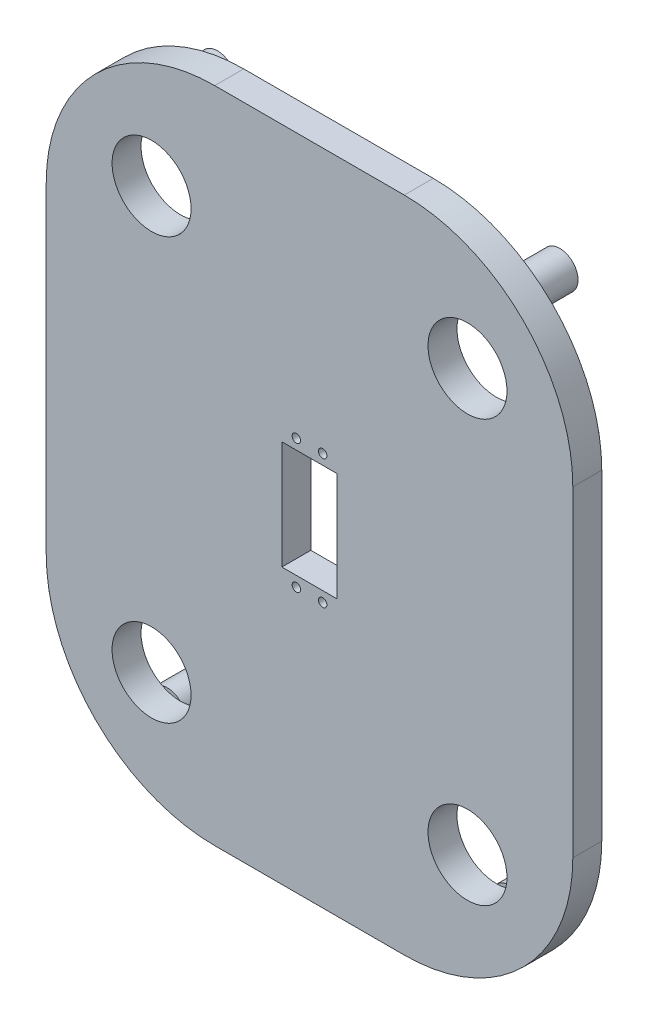
ISO-10303-21;
HEADER;
FILE_DESCRIPTION(('STEP AP214'),'2;1');
FILE_NAME('part.step','',(''),(''),'','','');
FILE_SCHEMA(('AUTOMOTIVE_DESIGN { 1 0 10303 214 1 1 1 1 }'));
ENDSEC;
DATA;
#1=APPLICATION_CONTEXT('core data for automotive mechanical design processes');
#2=APPLICATION_PROTOCOL_DEFINITION('international standard','automotive_design',2000,#1);
#3=PRODUCT_CONTEXT('',#1,'mechanical');
#4=PRODUCT('Part','Part','',(#3));
#5=PRODUCT_RELATED_PRODUCT_CATEGORY('part','',(#4));
#6=PRODUCT_DEFINITION_FORMATION('','',#4);
#7=PRODUCT_DEFINITION_CONTEXT('part definition',#1,'design');
#8=PRODUCT_DEFINITION('design','',#6,#7);
#9=PRODUCT_DEFINITION_SHAPE('','',#8);
#10=(LENGTH_UNIT() NAMED_UNIT(*) SI_UNIT(.MILLI.,.METRE.));
#11=(NAMED_UNIT(*) PLANE_ANGLE_UNIT() SI_UNIT($,.RADIAN.));
#12=(NAMED_UNIT(*) SI_UNIT($,.STERADIAN.) SOLID_ANGLE_UNIT());
#13=UNCERTAINTY_MEASURE_WITH_UNIT(LENGTH_MEASURE(1.E-05),#10,'distance_accuracy_value','');
#14=(GEOMETRIC_REPRESENTATION_CONTEXT(3) GLOBAL_UNCERTAINTY_ASSIGNED_CONTEXT((#13)) GLOBAL_UNIT_ASSIGNED_CONTEXT((#10,
#11,#12)) REPRESENTATION_CONTEXT('',''));
#15=CARTESIAN_POINT('',(0.,0.,0.));
#16=DIRECTION('',(0.,0.,1.));
#17=DIRECTION('',(1.,0.,0.));
#18=AXIS2_PLACEMENT_3D('',#15,#16,#17);
#19=CARTESIAN_POINT('',(-2.50000000000001,-50.,11.));
#20=DIRECTION('',(0.,0.,1.));
#21=DIRECTION('',(1.,0.,0.));
#22=AXIS2_PLACEMENT_3D('',#19,#20,#21);
#23=PLANE('',#22);
#24=CARTESIAN_POINT('',(-62.5,-25.,11.));
#25=DIRECTION('',(0.,0.,1.));
#26=DIRECTION('',(1.,0.,0.));
#27=AXIS2_PLACEMENT_3D('',#24,#25,#26);
#28=CIRCLE('',#27,15.);
#29=CARTESIAN_POINT('',(-47.5,-25.,11.));
#30=VERTEX_POINT('',#29);
#31=EDGE_CURVE('E284',#30,#30,#28,.F.);
#32=ORIENTED_EDGE('',*,*,#31,.T.);
#33=EDGE_LOOP('',(#32));
#34=FACE_BOUND('',#33,.T.);
#35=CARTESIAN_POINT('',(57.5,-24.9999999999999,11.));
#36=DIRECTION('',(0.,0.,1.));
#37=DIRECTION('',(1.,0.,0.));
#38=AXIS2_PLACEMENT_3D('',#35,#36,#37);
#39=CIRCLE('',#38,15.);
#40=CARTESIAN_POINT('',(72.5,-24.9999999999999,11.));
#41=VERTEX_POINT('',#40);
#42=EDGE_CURVE('E498',#41,#41,#39,.T.);
#43=ORIENTED_EDGE('',*,*,#42,.F.);
#44=EDGE_LOOP('',(#43));
#45=FACE_BOUND('',#44,.T.);
#46=CARTESIAN_POINT('',(-62.5,135.,11.));
#47=DIRECTION('',(0.,0.,1.));
#48=DIRECTION('',(1.,0.,0.));
#49=AXIS2_PLACEMENT_3D('',#46,#47,#48);
#50=CIRCLE('',#49,15.);
#51=CARTESIAN_POINT('',(-47.5,135.,11.));
#52=VERTEX_POINT('',#51);
#53=EDGE_CURVE('E484',#52,#52,#50,.T.);
#54=ORIENTED_EDGE('',*,*,#53,.F.);
#55=EDGE_LOOP('',(#54));
#56=FACE_BOUND('',#55,.T.);
#57=CARTESIAN_POINT('',(2.49999999999999,30.5,11.));
#58=DIRECTION('',(0.,0.,1.));
#59=DIRECTION('',(1.,0.,0.));
#60=AXIS2_PLACEMENT_3D('',#57,#58,#59);
#61=CIRCLE('',#60,1.6);
#62=CARTESIAN_POINT('',(4.09999999999999,30.5,11.));
#63=VERTEX_POINT('',#62);
#64=EDGE_CURVE('E378',#63,#63,#61,.T.);
#65=ORIENTED_EDGE('',*,*,#64,.F.);
#66=EDGE_LOOP('',(#65));
#67=FACE_BOUND('',#66,.T.);
#68=CARTESIAN_POINT('',(-7.50000000000001,79.5,11.));
#69=DIRECTION('',(0.,0.,1.));
#70=DIRECTION('',(1.,0.,0.));
#71=AXIS2_PLACEMENT_3D('',#68,#69,#70);
#72=CIRCLE('',#71,1.6);
#73=CARTESIAN_POINT('',(-5.90000000000001,79.5,11.));
#74=VERTEX_POINT('',#73);
#75=EDGE_CURVE('E361',#74,#74,#72,.T.);
#76=ORIENTED_EDGE('',*,*,#75,.F.);
#77=EDGE_LOOP('',(#76));
#78=FACE_BOUND('',#77,.T.);
#79=CARTESIAN_POINT('',(2.49999999999999,79.5,11.));
#80=DIRECTION('',(0.,0.,1.));
#81=DIRECTION('',(-1.,0.,0.));
#82=AXIS2_PLACEMENT_3D('',#79,#80,#81);
#83=CIRCLE('',#82,1.6);
#84=CARTESIAN_POINT('',(0.899999999999986,79.5,11.));
#85=VERTEX_POINT('',#84);
#86=EDGE_CURVE('E370',#85,#85,#83,.T.);
#87=ORIENTED_EDGE('',*,*,#86,.F.);
#88=EDGE_LOOP('',(#87));
#89=FACE_BOUND('',#88,.T.);
#90=CARTESIAN_POINT('',(-7.50000000000001,30.5,11.));
#91=DIRECTION('',(0.,0.,1.));
#92=DIRECTION('',(-1.,0.,0.));
#93=AXIS2_PLACEMENT_3D('',#90,#91,#92);
#94=CIRCLE('',#93,1.6);
#95=CARTESIAN_POINT('',(-9.10000000000001,30.5,11.));
#96=VERTEX_POINT('',#95);
#97=EDGE_CURVE('E386',#96,#96,#94,.T.);
#98=ORIENTED_EDGE('',*,*,#97,.F.);
#99=EDGE_LOOP('',(#98));
#100=FACE_BOUND('',#99,.T.);
#101=DIRECTION('',(1.,0.,0.));
#102=VECTOR('',#101,1.);
#103=CARTESIAN_POINT('',(0.,75.6,11.));
#104=LINE('',#103,#102);
#105=CARTESIAN_POINT('',(-13.,75.6,11.));
#106=VERTEX_POINT('',#105);
#107=CARTESIAN_POINT('',(8.,75.6,11.));
#108=VERTEX_POINT('',#107);
#109=EDGE_CURVE('E407',#106,#108,#104,.T.);
#110=ORIENTED_EDGE('',*,*,#109,.T.);
#111=DIRECTION('',(0.,1.,0.));
#112=VECTOR('',#111,1.);
#113=CARTESIAN_POINT('',(7.99999999999999,75.5,11.));
#114=LINE('',#113,#112);
#115=CARTESIAN_POINT('',(8.00000000000001,34.4,11.));
#116=VERTEX_POINT('',#115);
#117=EDGE_CURVE('E353',#116,#108,#114,.T.);
#118=ORIENTED_EDGE('',*,*,#117,.F.);
#119=DIRECTION('',(1.,0.,0.));
#120=VECTOR('',#119,1.);
#121=CARTESIAN_POINT('',(0.,34.4,11.));
#122=LINE('',#121,#120);
#123=CARTESIAN_POINT('',(-13.,34.4,11.));
#124=VERTEX_POINT('',#123);
#125=EDGE_CURVE('E408',#124,#116,#122,.T.);
#126=ORIENTED_EDGE('',*,*,#125,.F.);
#127=DIRECTION('',(0.,-1.,0.));
#128=VECTOR('',#127,1.);
#129=CARTESIAN_POINT('',(-13.,75.5,11.));
#130=LINE('',#129,#128);
#131=EDGE_CURVE('E357',#106,#124,#130,.T.);
#132=ORIENTED_EDGE('',*,*,#131,.F.);
#133=EDGE_LOOP('',(#110,#118,#126,#132));
#134=FACE_BOUND('',#133,.T.);
#135=DIRECTION('',(0.,-1.,0.));
#136=VECTOR('',#135,1.);
#137=CARTESIAN_POINT('',(-102.5,0.,11.));
#138=LINE('',#137,#136);
#139=CARTESIAN_POINT('',(-102.5,116.,11.));
#140=VERTEX_POINT('',#139);
#141=CARTESIAN_POINT('',(-102.5,-5.99999999999998,11.));
#142=VERTEX_POINT('',#141);
#143=EDGE_CURVE('E434',#140,#142,#138,.T.);
#144=ORIENTED_EDGE('',*,*,#143,.T.);
#145=CARTESIAN_POINT('',(-38.5,-5.99999999999999,11.));
#146=DIRECTION('',(0.,0.,1.));
#147=DIRECTION('',(1.,0.,0.));
#148=AXIS2_PLACEMENT_3D('',#145,#146,#147);
#149=CIRCLE('',#148,64.);
#150=CARTESIAN_POINT('',(-38.5,-70.,11.));
#151=VERTEX_POINT('',#150);
#152=EDGE_CURVE('E298',#142,#151,#149,.T.);
#153=ORIENTED_EDGE('',*,*,#152,.T.);
#154=DIRECTION('',(1.,0.,0.));
#155=VECTOR('',#154,1.);
#156=CARTESIAN_POINT('',(0.,-70.,11.));
#157=LINE('',#156,#155);
#158=CARTESIAN_POINT('',(33.5,-70.,11.));
#159=VERTEX_POINT('',#158);
#160=EDGE_CURVE('E430',#151,#159,#157,.T.);
#161=ORIENTED_EDGE('',*,*,#160,.T.);
#162=CARTESIAN_POINT('',(33.5,-5.99999999999999,11.));
#163=DIRECTION('',(0.,0.,1.));
#164=DIRECTION('',(1.,0.,0.));
#165=AXIS2_PLACEMENT_3D('',#162,#163,#164);
#166=CIRCLE('',#165,64.);
#167=CARTESIAN_POINT('',(97.5,-5.99999999999995,11.));
#168=VERTEX_POINT('',#167);
#169=EDGE_CURVE('E312',#159,#168,#166,.T.);
#170=ORIENTED_EDGE('',*,*,#169,.T.);
#171=DIRECTION('',(0.,-1.,0.));
#172=VECTOR('',#171,1.);
#173=CARTESIAN_POINT('',(97.5,0.,11.));
#174=LINE('',#173,#172);
#175=CARTESIAN_POINT('',(97.5,116.,11.));
#176=VERTEX_POINT('',#175);
#177=EDGE_CURVE('E442',#176,#168,#174,.T.);
#178=ORIENTED_EDGE('',*,*,#177,.F.);
#179=CARTESIAN_POINT('',(33.5,116.,11.));
#180=DIRECTION('',(0.,0.,1.));
#181=DIRECTION('',(1.,0.,0.));
#182=AXIS2_PLACEMENT_3D('',#179,#180,#181);
#183=CIRCLE('',#182,64.);
#184=CARTESIAN_POINT('',(33.5,180.,11.));
#185=VERTEX_POINT('',#184);
#186=EDGE_CURVE('E327',#176,#185,#183,.T.);
#187=ORIENTED_EDGE('',*,*,#186,.T.);
#188=DIRECTION('',(1.,0.,0.));
#189=VECTOR('',#188,1.);
#190=CARTESIAN_POINT('',(0.,180.,11.));
#191=LINE('',#190,#189);
#192=CARTESIAN_POINT('',(-38.5,180.,11.));
#193=VERTEX_POINT('',#192);
#194=EDGE_CURVE('E438',#193,#185,#191,.T.);
#195=ORIENTED_EDGE('',*,*,#194,.F.);
#196=CARTESIAN_POINT('',(-38.5,116.,11.));
#197=DIRECTION('',(0.,0.,1.));
#198=DIRECTION('',(1.,0.,0.));
#199=AXIS2_PLACEMENT_3D('',#196,#197,#198);
#200=CIRCLE('',#199,64.);
#201=EDGE_CURVE('E338',#193,#140,#200,.T.);
#202=ORIENTED_EDGE('',*,*,#201,.T.);
#203=EDGE_LOOP('',(#144,#153,#161,#170,#178,#187,#195,#202));
#204=FACE_BOUND('',#203,.T.);
#205=CARTESIAN_POINT('',(57.5,135.,11.));
#206=DIRECTION('',(0.,0.,1.));
#207=DIRECTION('',(1.,0.,0.));
#208=AXIS2_PLACEMENT_3D('',#205,#206,#207);
#209=CIRCLE('',#208,15.);
#210=CARTESIAN_POINT('',(72.5,135.,11.));
#211=VERTEX_POINT('',#210);
#212=EDGE_CURVE('E279',#211,#211,#209,.F.);
#213=ORIENTED_EDGE('',*,*,#212,.T.);
#214=EDGE_LOOP('',(#213));
#215=FACE_BOUND('',#214,.T.);
#216=ADVANCED_FACE('F154',(#34,#45,#56,#67,#78,#89,#100,#134,#204,#215),#23,.T.);
#217=CARTESIAN_POINT('',(-2.50000000000001,-50.,0.));
#218=DIRECTION('',(0.,0.,1.));
#219=DIRECTION('',(1.,0.,0.));
#220=AXIS2_PLACEMENT_3D('',#217,#218,#219);
#221=PLANE('',#220);
#222=CARTESIAN_POINT('',(-62.5,-25.,0.));
#223=DIRECTION('',(0.,0.,1.));
#224=DIRECTION('',(1.,0.,0.));
#225=AXIS2_PLACEMENT_3D('',#222,#223,#224);
#226=CIRCLE('',#225,15.);
#227=CARTESIAN_POINT('',(-62.6978440235962,-39.9986952013276,0.));
#228=VERTEX_POINT('',#227);
#229=CARTESIAN_POINT('',(-69.3836412503928,-38.3272458946284,0.));
#230=VERTEX_POINT('',#229);
#231=EDGE_CURVE('E494',#228,#230,#226,.T.);
#232=ORIENTED_EDGE('',*,*,#231,.T.);
#233=CARTESIAN_POINT('',(-67.5,-45.,0.));
#234=DIRECTION('',(0.,0.,1.));
#235=DIRECTION('',(1.,0.,0.));
#236=AXIS2_PLACEMENT_3D('',#233,#234,#235);
#237=CIRCLE('',#236,6.93352375859022);
#238=EDGE_CURVE('E290',#228,#230,#237,.F.);
#239=ORIENTED_EDGE('',*,*,#238,.F.);
#240=EDGE_LOOP('',(#232,#239));
#241=FACE_BOUND('',#240,.T.);
#242=CARTESIAN_POINT('',(62.5,-45.,0.));
#243=DIRECTION('',(0.,0.,-1.));
#244=DIRECTION('',(-1.,0.,0.));
#245=AXIS2_PLACEMENT_3D('',#242,#243,#244);
#246=CIRCLE('',#245,6.93352375859016);
#247=CARTESIAN_POINT('',(57.6978440235963,-39.9986952013275,0.));
#248=VERTEX_POINT('',#247);
#249=CARTESIAN_POINT('',(64.3836412503928,-38.3272458946284,0.));
#250=VERTEX_POINT('',#249);
#251=EDGE_CURVE('E469',#248,#250,#246,.F.);
#252=ORIENTED_EDGE('',*,*,#251,.T.);
#253=CARTESIAN_POINT('',(57.5,-24.9999999999999,0.));
#254=DIRECTION('',(0.,0.,1.));
#255=DIRECTION('',(1.,0.,0.));
#256=AXIS2_PLACEMENT_3D('',#253,#254,#255);
#257=CIRCLE('',#256,15.);
#258=EDGE_CURVE('E503',#248,#250,#257,.F.);
#259=ORIENTED_EDGE('',*,*,#258,.F.);
#260=EDGE_LOOP('',(#252,#259));
#261=FACE_BOUND('',#260,.T.);
#262=CARTESIAN_POINT('',(-67.5,155.,0.));
#263=DIRECTION('',(0.,0.,-1.));
#264=DIRECTION('',(-1.,0.,0.));
#265=AXIS2_PLACEMENT_3D('',#262,#263,#264);
#266=CIRCLE('',#265,6.93352375859017);
#267=CARTESIAN_POINT('',(-62.6978440235962,149.998695201328,0.));
#268=VERTEX_POINT('',#267);
#269=CARTESIAN_POINT('',(-69.3836412503928,148.327245894628,0.));
#270=VERTEX_POINT('',#269);
#271=EDGE_CURVE('E461',#268,#270,#266,.F.);
#272=ORIENTED_EDGE('',*,*,#271,.T.);
#273=CARTESIAN_POINT('',(-62.5,135.,0.));
#274=DIRECTION('',(0.,0.,1.));
#275=DIRECTION('',(1.,0.,0.));
#276=AXIS2_PLACEMENT_3D('',#273,#274,#275);
#277=CIRCLE('',#276,15.);
#278=EDGE_CURVE('E483',#268,#270,#277,.F.);
#279=ORIENTED_EDGE('',*,*,#278,.F.);
#280=EDGE_LOOP('',(#272,#279));
#281=FACE_BOUND('',#280,.T.);
#282=CARTESIAN_POINT('',(-7.50000000000001,79.5,0.));
#283=DIRECTION('',(0.,0.,1.));
#284=DIRECTION('',(1.,0.,0.));
#285=AXIS2_PLACEMENT_3D('',#282,#283,#284);
#286=CIRCLE('',#285,1.6);
#287=CARTESIAN_POINT('',(-5.90000000000001,79.5,0.));
#288=VERTEX_POINT('',#287);
#289=EDGE_CURVE('E366',#288,#288,#286,.T.);
#290=ORIENTED_EDGE('',*,*,#289,.T.);
#291=EDGE_LOOP('',(#290));
#292=FACE_BOUND('',#291,.T.);
#293=CARTESIAN_POINT('',(2.49999999999999,79.5,0.));
#294=DIRECTION('',(0.,0.,1.));
#295=DIRECTION('',(-1.,0.,0.));
#296=AXIS2_PLACEMENT_3D('',#293,#294,#295);
#297=CIRCLE('',#296,1.6);
#298=CARTESIAN_POINT('',(0.899999999999986,79.5,0.));
#299=VERTEX_POINT('',#298);
#300=EDGE_CURVE('E374',#299,#299,#297,.T.);
#301=ORIENTED_EDGE('',*,*,#300,.T.);
#302=EDGE_LOOP('',(#301));
#303=FACE_BOUND('',#302,.T.);
#304=CARTESIAN_POINT('',(2.49999999999999,30.5,0.));
#305=DIRECTION('',(0.,0.,1.));
#306=DIRECTION('',(1.,0.,0.));
#307=AXIS2_PLACEMENT_3D('',#304,#305,#306);
#308=CIRCLE('',#307,1.6);
#309=CARTESIAN_POINT('',(4.09999999999999,30.5,0.));
#310=VERTEX_POINT('',#309);
#311=EDGE_CURVE('E382',#310,#310,#308,.T.);
#312=ORIENTED_EDGE('',*,*,#311,.T.);
#313=EDGE_LOOP('',(#312));
#314=FACE_BOUND('',#313,.T.);
#315=CARTESIAN_POINT('',(-7.50000000000001,30.5,0.));
#316=DIRECTION('',(0.,0.,1.));
#317=DIRECTION('',(-1.,0.,0.));
#318=AXIS2_PLACEMENT_3D('',#315,#316,#317);
#319=CIRCLE('',#318,1.6);
#320=CARTESIAN_POINT('',(-9.10000000000001,30.5,0.));
#321=VERTEX_POINT('',#320);
#322=EDGE_CURVE('E390',#321,#321,#319,.T.);
#323=ORIENTED_EDGE('',*,*,#322,.T.);
#324=EDGE_LOOP('',(#323));
#325=FACE_BOUND('',#324,.T.);
#326=DIRECTION('',(0.,1.,0.));
#327=VECTOR('',#326,1.);
#328=CARTESIAN_POINT('',(7.99999999999999,75.5,0.));
#329=LINE('',#328,#327);
#330=CARTESIAN_POINT('',(8.00000000000001,34.4,0.));
#331=VERTEX_POINT('',#330);
#332=CARTESIAN_POINT('',(8.,75.6,0.));
#333=VERTEX_POINT('',#332);
#334=EDGE_CURVE('E354',#331,#333,#329,.T.);
#335=ORIENTED_EDGE('',*,*,#334,.T.);
#336=DIRECTION('',(1.,0.,0.));
#337=VECTOR('',#336,1.);
#338=CARTESIAN_POINT('',(0.,75.6,0.));
#339=LINE('',#338,#337);
#340=CARTESIAN_POINT('',(-13.,75.6,0.));
#341=VERTEX_POINT('',#340);
#342=EDGE_CURVE('E420',#341,#333,#339,.T.);
#343=ORIENTED_EDGE('',*,*,#342,.F.);
#344=DIRECTION('',(0.,-1.,0.));
#345=VECTOR('',#344,1.);
#346=CARTESIAN_POINT('',(-13.,75.5,0.));
#347=LINE('',#346,#345);
#348=CARTESIAN_POINT('',(-13.,34.4,0.));
#349=VERTEX_POINT('',#348);
#350=EDGE_CURVE('E358',#341,#349,#347,.T.);
#351=ORIENTED_EDGE('',*,*,#350,.T.);
#352=DIRECTION('',(1.,0.,0.));
#353=VECTOR('',#352,1.);
#354=CARTESIAN_POINT('',(0.,34.4,0.));
#355=LINE('',#354,#353);
#356=EDGE_CURVE('E403',#349,#331,#355,.T.);
#357=ORIENTED_EDGE('',*,*,#356,.T.);
#358=EDGE_LOOP('',(#335,#343,#351,#357));
#359=FACE_BOUND('',#358,.T.);
#360=DIRECTION('',(-1.,0.,0.));
#361=VECTOR('',#360,1.);
#362=CARTESIAN_POINT('',(0.,-70.,0.));
#363=LINE('',#362,#361);
#364=CARTESIAN_POINT('',(33.5,-70.,0.));
#365=VERTEX_POINT('',#364);
#366=CARTESIAN_POINT('',(-38.5,-70.,0.));
#367=VERTEX_POINT('',#366);
#368=EDGE_CURVE('E449',#365,#367,#363,.T.);
#369=ORIENTED_EDGE('',*,*,#368,.T.);
#370=CARTESIAN_POINT('',(-38.5,-5.99999999999999,0.));
#371=DIRECTION('',(0.,0.,1.));
#372=DIRECTION('',(1.,0.,0.));
#373=AXIS2_PLACEMENT_3D('',#370,#371,#372);
#374=CIRCLE('',#373,64.);
#375=CARTESIAN_POINT('',(-102.5,-5.99999999999998,0.));
#376=VERTEX_POINT('',#375);
#377=EDGE_CURVE('E294',#367,#376,#374,.F.);
#378=ORIENTED_EDGE('',*,*,#377,.T.);
#379=DIRECTION('',(0.,1.,0.));
#380=VECTOR('',#379,1.);
#381=CARTESIAN_POINT('',(-102.5,0.,0.));
#382=LINE('',#381,#380);
#383=CARTESIAN_POINT('',(-102.5,116.,0.));
#384=VERTEX_POINT('',#383);
#385=EDGE_CURVE('E453',#376,#384,#382,.T.);
#386=ORIENTED_EDGE('',*,*,#385,.T.);
#387=CARTESIAN_POINT('',(-38.5,116.,0.));
#388=DIRECTION('',(0.,0.,1.));
#389=DIRECTION('',(1.,0.,0.));
#390=AXIS2_PLACEMENT_3D('',#387,#388,#389);
#391=CIRCLE('',#390,64.);
#392=CARTESIAN_POINT('',(-38.5,180.,0.));
#393=VERTEX_POINT('',#392);
#394=EDGE_CURVE('E341',#384,#393,#391,.F.);
#395=ORIENTED_EDGE('',*,*,#394,.T.);
#396=DIRECTION('',(-1.,0.,0.));
#397=VECTOR('',#396,1.);
#398=CARTESIAN_POINT('',(0.,180.,0.));
#399=LINE('',#398,#397);
#400=CARTESIAN_POINT('',(33.5,180.,0.));
#401=VERTEX_POINT('',#400);
#402=EDGE_CURVE('E433',#401,#393,#399,.T.);
#403=ORIENTED_EDGE('',*,*,#402,.F.);
#404=CARTESIAN_POINT('',(33.5,116.,0.));
#405=DIRECTION('',(0.,0.,1.));
#406=DIRECTION('',(1.,0.,0.));
#407=AXIS2_PLACEMENT_3D('',#404,#405,#406);
#408=CIRCLE('',#407,64.);
#409=CARTESIAN_POINT('',(97.5,116.,0.));
#410=VERTEX_POINT('',#409);
#411=EDGE_CURVE('E323',#401,#410,#408,.F.);
#412=ORIENTED_EDGE('',*,*,#411,.T.);
#413=DIRECTION('',(0.,1.,0.));
#414=VECTOR('',#413,1.);
#415=CARTESIAN_POINT('',(97.5,0.,0.));
#416=LINE('',#415,#414);
#417=CARTESIAN_POINT('',(97.5,-5.99999999999996,0.));
#418=VERTEX_POINT('',#417);
#419=EDGE_CURVE('E412',#418,#410,#416,.T.);
#420=ORIENTED_EDGE('',*,*,#419,.F.);
#421=CARTESIAN_POINT('',(33.5,-5.99999999999999,0.));
#422=DIRECTION('',(0.,0.,1.));
#423=DIRECTION('',(1.,0.,0.));
#424=AXIS2_PLACEMENT_3D('',#421,#422,#423);
#425=CIRCLE('',#424,64.);
#426=EDGE_CURVE('E309',#418,#365,#425,.F.);
#427=ORIENTED_EDGE('',*,*,#426,.T.);
#428=EDGE_LOOP('',(#369,#378,#386,#395,#403,#412,#420,#427));
#429=FACE_BOUND('',#428,.T.);
#430=CARTESIAN_POINT('',(57.5,135.,0.));
#431=DIRECTION('',(0.,0.,1.));
#432=DIRECTION('',(1.,0.,0.));
#433=AXIS2_PLACEMENT_3D('',#430,#431,#432);
#434=CIRCLE('',#433,15.);
#435=CARTESIAN_POINT('',(57.6978440235962,149.998695201328,0.));
#436=VERTEX_POINT('',#435);
#437=CARTESIAN_POINT('',(64.3836412503928,148.327245894628,0.));
#438=VERTEX_POINT('',#437);
#439=EDGE_CURVE('E276',#436,#438,#434,.T.);
#440=ORIENTED_EDGE('',*,*,#439,.T.);
#441=CARTESIAN_POINT('',(62.5,155.,0.));
#442=DIRECTION('',(0.,0.,1.));
#443=DIRECTION('',(1.,0.,0.));
#444=AXIS2_PLACEMENT_3D('',#441,#442,#443);
#445=CIRCLE('',#444,6.93352375859016);
#446=EDGE_CURVE('E163',#436,#438,#445,.F.);
#447=ORIENTED_EDGE('',*,*,#446,.F.);
#448=EDGE_LOOP('',(#440,#447));
#449=FACE_BOUND('',#448,.T.);
#450=ADVANCED_FACE('F282',(#241,#261,#281,#292,#303,#314,#325,#359,#429,#449),#221,.F.);
#451=CARTESIAN_POINT('',(-38.5,-5.99999999999999,-320.156211871642));
#452=DIRECTION('',(0.,0.,-1.));
#453=DIRECTION('',(-1.,0.,0.));
#454=AXIS2_PLACEMENT_3D('',#451,#452,#453);
#455=CYLINDRICAL_SURFACE('',#454,64.);
#456=DIRECTION('',(0.,0.,-1.));
#457=VECTOR('',#456,1.);
#458=CARTESIAN_POINT('',(-38.5,-70.,-320.156211871642));
#459=LINE('',#458,#457);
#460=EDGE_CURVE('E305',#151,#367,#459,.T.);
#461=ORIENTED_EDGE('',*,*,#460,.F.);
#462=ORIENTED_EDGE('',*,*,#152,.F.);
#463=DIRECTION('',(0.,0.,-1.));
#464=VECTOR('',#463,1.);
#465=CARTESIAN_POINT('',(-102.5,-6.,-320.156211871642));
#466=LINE('',#465,#464);
#467=EDGE_CURVE('E301',#376,#142,#466,.F.);
#468=ORIENTED_EDGE('',*,*,#467,.F.);
#469=ORIENTED_EDGE('',*,*,#377,.F.);
#470=EDGE_LOOP('',(#461,#462,#468,#469));
#471=FACE_BOUND('',#470,.T.);
#472=ADVANCED_FACE('F156',(#471),#455,.T.);
#473=CARTESIAN_POINT('',(33.5,-5.99999999999999,-320.156211871642));
#474=DIRECTION('',(0.,0.,1.));
#475=DIRECTION('',(1.,0.,0.));
#476=AXIS2_PLACEMENT_3D('',#473,#474,#475);
#477=CYLINDRICAL_SURFACE('',#476,64.);
#478=DIRECTION('',(0.,0.,-1.));
#479=VECTOR('',#478,1.);
#480=CARTESIAN_POINT('',(97.5,-5.99999999999998,-320.156211871642));
#481=LINE('',#480,#479);
#482=EDGE_CURVE('E319',#168,#418,#481,.T.);
#483=ORIENTED_EDGE('',*,*,#482,.F.);
#484=ORIENTED_EDGE('',*,*,#169,.F.);
#485=DIRECTION('',(0.,0.,-1.));
#486=VECTOR('',#485,1.);
#487=CARTESIAN_POINT('',(33.5,-70.,-320.156211871642));
#488=LINE('',#487,#486);
#489=EDGE_CURVE('E315',#365,#159,#488,.F.);
#490=ORIENTED_EDGE('',*,*,#489,.F.);
#491=ORIENTED_EDGE('',*,*,#426,.F.);
#492=EDGE_LOOP('',(#483,#484,#490,#491));
#493=FACE_BOUND('',#492,.T.);
#494=ADVANCED_FACE('F550',(#493),#477,.T.);
#495=CARTESIAN_POINT('',(33.5,116.,-320.156211871642));
#496=DIRECTION('',(0.,0.,-1.));
#497=DIRECTION('',(-1.,0.,0.));
#498=AXIS2_PLACEMENT_3D('',#495,#496,#497);
#499=CYLINDRICAL_SURFACE('',#498,64.);
#500=DIRECTION('',(0.,0.,-1.));
#501=VECTOR('',#500,1.);
#502=CARTESIAN_POINT('',(33.5,180.,-320.156211871642));
#503=LINE('',#502,#501);
#504=EDGE_CURVE('E334',#185,#401,#503,.T.);
#505=ORIENTED_EDGE('',*,*,#504,.F.);
#506=ORIENTED_EDGE('',*,*,#186,.F.);
#507=DIRECTION('',(0.,0.,-1.));
#508=VECTOR('',#507,1.);
#509=CARTESIAN_POINT('',(97.5,116.,-320.156211871642));
#510=LINE('',#509,#508);
#511=EDGE_CURVE('E330',#410,#176,#510,.F.);
#512=ORIENTED_EDGE('',*,*,#511,.F.);
#513=ORIENTED_EDGE('',*,*,#411,.F.);
#514=EDGE_LOOP('',(#505,#506,#512,#513));
#515=FACE_BOUND('',#514,.T.);
#516=ADVANCED_FACE('F547',(#515),#499,.T.);
#517=CARTESIAN_POINT('',(-38.5,116.,-320.156211871642));
#518=DIRECTION('',(0.,0.,-1.));
#519=DIRECTION('',(-1.,0.,0.));
#520=AXIS2_PLACEMENT_3D('',#517,#518,#519);
#521=CYLINDRICAL_SURFACE('',#520,64.);
#522=DIRECTION('',(0.,0.,1.));
#523=VECTOR('',#522,1.);
#524=CARTESIAN_POINT('',(-38.5,180.,-320.156211871642));
#525=LINE('',#524,#523);
#526=EDGE_CURVE('E349',#393,#193,#525,.T.);
#527=ORIENTED_EDGE('',*,*,#526,.F.);
#528=ORIENTED_EDGE('',*,*,#394,.F.);
#529=DIRECTION('',(0.,0.,1.));
#530=VECTOR('',#529,1.);
#531=CARTESIAN_POINT('',(-102.5,116.,-320.156211871642));
#532=LINE('',#531,#530);
#533=EDGE_CURVE('E345',#140,#384,#532,.F.);
#534=ORIENTED_EDGE('',*,*,#533,.F.);
#535=ORIENTED_EDGE('',*,*,#201,.F.);
#536=EDGE_LOOP('',(#527,#528,#534,#535));
#537=FACE_BOUND('',#536,.T.);
#538=ADVANCED_FACE('F544',(#537),#521,.T.);
#539=CARTESIAN_POINT('',(-13.,75.5,11.));
#540=DIRECTION('',(1.,0.,0.));
#541=DIRECTION('',(0.,1.,0.));
#542=AXIS2_PLACEMENT_3D('',#539,#540,#541);
#543=PLANE('',#542);
#544=ORIENTED_EDGE('',*,*,#350,.F.);
#545=DIRECTION('',(0.,0.,1.));
#546=VECTOR('',#545,1.);
#547=CARTESIAN_POINT('',(-13.,75.6,0.));
#548=LINE('',#547,#546);
#549=EDGE_CURVE('E394',#341,#106,#548,.T.);
#550=ORIENTED_EDGE('',*,*,#549,.T.);
#551=ORIENTED_EDGE('',*,*,#131,.T.);
#552=DIRECTION('',(0.,0.,1.));
#553=VECTOR('',#552,1.);
#554=CARTESIAN_POINT('',(-13.,34.4,0.));
#555=LINE('',#554,#553);
#556=EDGE_CURVE('E398',#349,#124,#555,.T.);
#557=ORIENTED_EDGE('',*,*,#556,.F.);
#558=EDGE_LOOP('',(#544,#550,#551,#557));
#559=FACE_BOUND('',#558,.T.);
#560=ADVANCED_FACE('F541',(#559),#543,.T.);
#561=CARTESIAN_POINT('',(7.99999999999999,75.5,11.));
#562=DIRECTION('',(-1.,0.,0.));
#563=DIRECTION('',(0.,-1.,0.));
#564=AXIS2_PLACEMENT_3D('',#561,#562,#563);
#565=PLANE('',#564);
#566=ORIENTED_EDGE('',*,*,#334,.F.);
#567=DIRECTION('',(0.,0.,1.));
#568=VECTOR('',#567,1.);
#569=CARTESIAN_POINT('',(8.00000000000001,34.4,0.));
#570=LINE('',#569,#568);
#571=EDGE_CURVE('E402',#331,#116,#570,.T.);
#572=ORIENTED_EDGE('',*,*,#571,.T.);
#573=ORIENTED_EDGE('',*,*,#117,.T.);
#574=DIRECTION('',(0.,0.,1.));
#575=VECTOR('',#574,1.);
#576=CARTESIAN_POINT('',(8.,75.6,0.));
#577=LINE('',#576,#575);
#578=EDGE_CURVE('E416',#333,#108,#577,.T.);
#579=ORIENTED_EDGE('',*,*,#578,.F.);
#580=EDGE_LOOP('',(#566,#572,#573,#579));
#581=FACE_BOUND('',#580,.T.);
#582=ADVANCED_FACE('F623',(#581),#565,.T.);
#583=CARTESIAN_POINT('',(-7.50000000000001,79.5,11.));
#584=DIRECTION('',(0.,0.,-1.));
#585=DIRECTION('',(-1.,0.,0.));
#586=AXIS2_PLACEMENT_3D('',#583,#584,#585);
#587=CYLINDRICAL_SURFACE('',#586,1.6);
#588=ORIENTED_EDGE('',*,*,#75,.T.);
#589=EDGE_LOOP('',(#588));
#590=FACE_BOUND('',#589,.T.);
#591=ORIENTED_EDGE('',*,*,#289,.F.);
#592=EDGE_LOOP('',(#591));
#593=FACE_BOUND('',#592,.T.);
#594=ADVANCED_FACE('F620',(#590,#593),#587,.F.);
#595=CARTESIAN_POINT('',(2.49999999999999,79.5,11.));
#596=DIRECTION('',(0.,0.,-1.));
#597=DIRECTION('',(-1.,0.,0.));
#598=AXIS2_PLACEMENT_3D('',#595,#596,#597);
#599=CYLINDRICAL_SURFACE('',#598,1.6);
#600=ORIENTED_EDGE('',*,*,#86,.T.);
#601=EDGE_LOOP('',(#600));
#602=FACE_BOUND('',#601,.T.);
#603=ORIENTED_EDGE('',*,*,#300,.F.);
#604=EDGE_LOOP('',(#603));
#605=FACE_BOUND('',#604,.T.);
#606=ADVANCED_FACE('F616',(#602,#605),#599,.F.);
#607=CARTESIAN_POINT('',(2.49999999999999,30.5,11.));
#608=DIRECTION('',(0.,0.,-1.));
#609=DIRECTION('',(-1.,0.,0.));
#610=AXIS2_PLACEMENT_3D('',#607,#608,#609);
#611=CYLINDRICAL_SURFACE('',#610,1.6);
#612=ORIENTED_EDGE('',*,*,#64,.T.);
#613=EDGE_LOOP('',(#612));
#614=FACE_BOUND('',#613,.T.);
#615=ORIENTED_EDGE('',*,*,#311,.F.);
#616=EDGE_LOOP('',(#615));
#617=FACE_BOUND('',#616,.T.);
#618=ADVANCED_FACE('F612',(#614,#617),#611,.F.);
#619=CARTESIAN_POINT('',(-7.50000000000001,30.5,11.));
#620=DIRECTION('',(0.,0.,-1.));
#621=DIRECTION('',(-1.,0.,0.));
#622=AXIS2_PLACEMENT_3D('',#619,#620,#621);
#623=CYLINDRICAL_SURFACE('',#622,1.6);
#624=ORIENTED_EDGE('',*,*,#97,.T.);
#625=EDGE_LOOP('',(#624));
#626=FACE_BOUND('',#625,.T.);
#627=ORIENTED_EDGE('',*,*,#322,.F.);
#628=EDGE_LOOP('',(#627));
#629=FACE_BOUND('',#628,.T.);
#630=ADVANCED_FACE('F605',(#626,#629),#623,.F.);
#631=CARTESIAN_POINT('',(0.,75.6,0.));
#632=DIRECTION('',(0.,-1.,0.));
#633=DIRECTION('',(0.,0.,-1.));
#634=AXIS2_PLACEMENT_3D('',#631,#632,#633);
#635=PLANE('',#634);
#636=ORIENTED_EDGE('',*,*,#109,.F.);
#637=ORIENTED_EDGE('',*,*,#549,.F.);
#638=ORIENTED_EDGE('',*,*,#342,.T.);
#639=ORIENTED_EDGE('',*,*,#578,.T.);
#640=EDGE_LOOP('',(#636,#637,#638,#639));
#641=FACE_BOUND('',#640,.T.);
#642=ADVANCED_FACE('F602',(#641),#635,.T.);
#643=CARTESIAN_POINT('',(0.,34.4,0.));
#644=DIRECTION('',(0.,-1.,0.));
#645=DIRECTION('',(0.,0.,-1.));
#646=AXIS2_PLACEMENT_3D('',#643,#644,#645);
#647=PLANE('',#646);
#648=ORIENTED_EDGE('',*,*,#125,.T.);
#649=ORIENTED_EDGE('',*,*,#571,.F.);
#650=ORIENTED_EDGE('',*,*,#356,.F.);
#651=ORIENTED_EDGE('',*,*,#556,.T.);
#652=EDGE_LOOP('',(#648,#649,#650,#651));
#653=FACE_BOUND('',#652,.T.);
#654=ADVANCED_FACE('F595',(#653),#647,.F.);
#655=CARTESIAN_POINT('',(0.,180.,-320.156211871642));
#656=DIRECTION('',(0.,-1.,0.));
#657=DIRECTION('',(0.,0.,-1.));
#658=AXIS2_PLACEMENT_3D('',#655,#656,#657);
#659=PLANE('',#658);
#660=ORIENTED_EDGE('',*,*,#194,.T.);
#661=ORIENTED_EDGE('',*,*,#504,.T.);
#662=ORIENTED_EDGE('',*,*,#402,.T.);
#663=ORIENTED_EDGE('',*,*,#526,.T.);
#664=EDGE_LOOP('',(#660,#661,#662,#663));
#665=FACE_BOUND('',#664,.T.);
#666=ADVANCED_FACE('F579',(#665),#659,.F.);
#667=CARTESIAN_POINT('',(-102.5,0.,-320.156211871642));
#668=DIRECTION('',(-1.,0.,0.));
#669=DIRECTION('',(0.,-1.,0.));
#670=AXIS2_PLACEMENT_3D('',#667,#668,#669);
#671=PLANE('',#670);
#672=ORIENTED_EDGE('',*,*,#385,.F.);
#673=ORIENTED_EDGE('',*,*,#467,.T.);
#674=ORIENTED_EDGE('',*,*,#143,.F.);
#675=ORIENTED_EDGE('',*,*,#533,.T.);
#676=EDGE_LOOP('',(#672,#673,#674,#675));
#677=FACE_BOUND('',#676,.T.);
#678=ADVANCED_FACE('F586',(#677),#671,.T.);
#679=CARTESIAN_POINT('',(0.,-70.,-320.156211871642));
#680=DIRECTION('',(0.,-1.,0.));
#681=DIRECTION('',(0.,0.,-1.));
#682=AXIS2_PLACEMENT_3D('',#679,#680,#681);
#683=PLANE('',#682);
#684=ORIENTED_EDGE('',*,*,#160,.F.);
#685=ORIENTED_EDGE('',*,*,#460,.T.);
#686=ORIENTED_EDGE('',*,*,#368,.F.);
#687=ORIENTED_EDGE('',*,*,#489,.T.);
#688=EDGE_LOOP('',(#684,#685,#686,#687));
#689=FACE_BOUND('',#688,.T.);
#690=ADVANCED_FACE('F573',(#689),#683,.T.);
#691=CARTESIAN_POINT('',(97.5,0.,-320.156211871642));
#692=DIRECTION('',(-1.,0.,0.));
#693=DIRECTION('',(0.,-1.,0.));
#694=AXIS2_PLACEMENT_3D('',#691,#692,#693);
#695=PLANE('',#694);
#696=ORIENTED_EDGE('',*,*,#177,.T.);
#697=ORIENTED_EDGE('',*,*,#482,.T.);
#698=ORIENTED_EDGE('',*,*,#419,.T.);
#699=ORIENTED_EDGE('',*,*,#511,.T.);
#700=EDGE_LOOP('',(#696,#697,#698,#699));
#701=FACE_BOUND('',#700,.T.);
#702=ADVANCED_FACE('F564',(#701),#695,.F.);
#703=CARTESIAN_POINT('',(-67.5,155.,-19.05));
#704=DIRECTION('',(0.,0.,1.));
#705=DIRECTION('',(1.,0.,0.));
#706=AXIS2_PLACEMENT_3D('',#703,#704,#705);
#707=CYLINDRICAL_SURFACE('',#706,6.93352375859017);
#708=CARTESIAN_POINT('',(-67.5,155.,-19.05));
#709=DIRECTION('',(0.,0.,-1.));
#710=DIRECTION('',(-1.,0.,0.));
#711=AXIS2_PLACEMENT_3D('',#708,#709,#710);
#712=CIRCLE('',#711,6.93352375859017);
#713=CARTESIAN_POINT('',(-74.4335237585902,155.,-19.05));
#714=VERTEX_POINT('',#713);
#715=EDGE_CURVE('E446',#714,#714,#712,.F.);
#716=ORIENTED_EDGE('',*,*,#715,.T.);
#717=EDGE_LOOP('',(#716));
#718=FACE_BOUND('',#717,.T.);
#719=EDGE_CURVE('E458',#270,#268,#266,.F.);
#720=ORIENTED_EDGE('',*,*,#719,.F.);
#721=ORIENTED_EDGE('',*,*,#271,.F.);
#722=EDGE_LOOP('',(#720,#721));
#723=FACE_BOUND('',#722,.T.);
#724=ADVANCED_FACE('F601',(#718,#723),#707,.T.);
#725=CARTESIAN_POINT('',(0.,0.,-19.05));
#726=DIRECTION('',(0.,0.,-1.));
#727=DIRECTION('',(-1.,0.,0.));
#728=AXIS2_PLACEMENT_3D('',#725,#726,#727);
#729=PLANE('',#728);
#730=ORIENTED_EDGE('',*,*,#715,.F.);
#731=EDGE_LOOP('',(#730));
#732=FACE_BOUND('',#731,.T.);
#733=ADVANCED_FACE('F713',(#732),#729,.T.);
#734=CARTESIAN_POINT('',(62.5,-45.,-19.05));
#735=DIRECTION('',(0.,0.,1.));
#736=DIRECTION('',(1.,0.,0.));
#737=AXIS2_PLACEMENT_3D('',#734,#735,#736);
#738=CYLINDRICAL_SURFACE('',#737,6.93352375859016);
#739=CARTESIAN_POINT('',(62.5,-45.,-19.05));
#740=DIRECTION('',(0.,0.,-1.));
#741=DIRECTION('',(-1.,0.,0.));
#742=AXIS2_PLACEMENT_3D('',#739,#740,#741);
#743=CIRCLE('',#742,6.93352375859016);
#744=CARTESIAN_POINT('',(55.5664762414099,-45.,-19.05));
#745=VERTEX_POINT('',#744);
#746=EDGE_CURVE('E465',#745,#745,#743,.F.);
#747=ORIENTED_EDGE('',*,*,#746,.T.);
#748=EDGE_LOOP('',(#747));
#749=FACE_BOUND('',#748,.T.);
#750=EDGE_CURVE('E471',#250,#248,#246,.F.);
#751=ORIENTED_EDGE('',*,*,#750,.F.);
#752=ORIENTED_EDGE('',*,*,#251,.F.);
#753=EDGE_LOOP('',(#751,#752));
#754=FACE_BOUND('',#753,.T.);
#755=ADVANCED_FACE('F516',(#749,#754),#738,.T.);
#756=CARTESIAN_POINT('',(0.,0.,-19.05));
#757=DIRECTION('',(0.,0.,-1.));
#758=DIRECTION('',(-1.,0.,0.));
#759=AXIS2_PLACEMENT_3D('',#756,#757,#758);
#760=PLANE('',#759);
#761=ORIENTED_EDGE('',*,*,#746,.F.);
#762=EDGE_LOOP('',(#761));
#763=FACE_BOUND('',#762,.T.);
#764=ADVANCED_FACE('F734',(#763),#760,.T.);
#765=CARTESIAN_POINT('',(-67.5,-45.,-19.05));
#766=DIRECTION('',(0.,0.,1.));
#767=DIRECTION('',(1.,0.,0.));
#768=AXIS2_PLACEMENT_3D('',#765,#766,#767);
#769=CYLINDRICAL_SURFACE('',#768,6.93352375859022);
#770=CARTESIAN_POINT('',(-67.5,-45.,-19.05));
#771=DIRECTION('',(0.,0.,-1.));
#772=DIRECTION('',(-1.,0.,0.));
#773=AXIS2_PLACEMENT_3D('',#770,#771,#772);
#774=CIRCLE('',#773,6.93352375859022);
#775=CARTESIAN_POINT('',(-74.4335237585902,-45.,-19.05));
#776=VERTEX_POINT('',#775);
#777=EDGE_CURVE('E470',#776,#776,#774,.T.);
#778=ORIENTED_EDGE('',*,*,#777,.F.);
#779=EDGE_LOOP('',(#778));
#780=FACE_BOUND('',#779,.T.);
#781=EDGE_CURVE('E287',#230,#228,#237,.F.);
#782=ORIENTED_EDGE('',*,*,#781,.T.);
#783=ORIENTED_EDGE('',*,*,#238,.T.);
#784=EDGE_LOOP('',(#782,#783));
#785=FACE_BOUND('',#784,.T.);
#786=ADVANCED_FACE('F744',(#780,#785),#769,.T.);
#787=CARTESIAN_POINT('',(0.,0.,-19.05));
#788=DIRECTION('',(0.,0.,-1.));
#789=DIRECTION('',(-1.,0.,0.));
#790=AXIS2_PLACEMENT_3D('',#787,#788,#789);
#791=PLANE('',#790);
#792=ORIENTED_EDGE('',*,*,#777,.T.);
#793=EDGE_LOOP('',(#792));
#794=FACE_BOUND('',#793,.T.);
#795=ADVANCED_FACE('F756',(#794),#791,.T.);
#796=CARTESIAN_POINT('',(62.5,155.,-19.05));
#797=DIRECTION('',(0.,0.,1.));
#798=DIRECTION('',(1.,0.,0.));
#799=AXIS2_PLACEMENT_3D('',#796,#797,#798);
#800=CYLINDRICAL_SURFACE('',#799,6.93352375859016);
#801=CARTESIAN_POINT('',(62.5,155.,-19.05));
#802=DIRECTION('',(0.,0.,-1.));
#803=DIRECTION('',(-1.,0.,0.));
#804=AXIS2_PLACEMENT_3D('',#801,#802,#803);
#805=CIRCLE('',#804,6.93352375859016);
#806=CARTESIAN_POINT('',(55.5664762414098,155.,-19.05));
#807=VERTEX_POINT('',#806);
#808=EDGE_CURVE('E477',#807,#807,#805,.T.);
#809=ORIENTED_EDGE('',*,*,#808,.F.);
#810=EDGE_LOOP('',(#809));
#811=FACE_BOUND('',#810,.T.);
#812=EDGE_CURVE('E12',#438,#436,#445,.F.);
#813=ORIENTED_EDGE('',*,*,#812,.T.);
#814=ORIENTED_EDGE('',*,*,#446,.T.);
#815=EDGE_LOOP('',(#813,#814));
#816=FACE_BOUND('',#815,.T.);
#817=ADVANCED_FACE('F285',(#811,#816),#800,.T.);
#818=CARTESIAN_POINT('',(62.5,155.,-19.05));
#819=DIRECTION('',(0.,0.,-1.));
#820=DIRECTION('',(-1.,0.,0.));
#821=AXIS2_PLACEMENT_3D('',#818,#819,#820);
#822=PLANE('',#821);
#823=ORIENTED_EDGE('',*,*,#808,.T.);
#824=EDGE_LOOP('',(#823));
#825=FACE_BOUND('',#824,.T.);
#826=ADVANCED_FACE('F777',(#825),#822,.T.);
#827=CARTESIAN_POINT('',(-2.50000000000001,-50.,0.));
#828=DIRECTION('',(0.,0.,1.));
#829=DIRECTION('',(1.,0.,0.));
#830=AXIS2_PLACEMENT_3D('',#827,#828,#829);
#831=PLANE('',#830);
#832=ORIENTED_EDGE('',*,*,#812,.F.);
#833=EDGE_CURVE('E268',#438,#436,#434,.T.);
#834=ORIENTED_EDGE('',*,*,#833,.T.);
#835=EDGE_LOOP('',(#832,#834));
#836=FACE_BOUND('',#835,.T.);
#837=ADVANCED_FACE('F267',(#836),#831,.T.);
#838=CARTESIAN_POINT('',(57.5,135.,-169.705627484771));
#839=DIRECTION('',(0.,0.,1.));
#840=DIRECTION('',(1.,0.,0.));
#841=AXIS2_PLACEMENT_3D('',#838,#839,#840);
#842=CYLINDRICAL_SURFACE('',#841,15.);
#843=ORIENTED_EDGE('',*,*,#833,.F.);
#844=ORIENTED_EDGE('',*,*,#439,.F.);
#845=EDGE_LOOP('',(#843,#844));
#846=FACE_BOUND('',#845,.T.);
#847=ORIENTED_EDGE('',*,*,#212,.F.);
#848=EDGE_LOOP('',(#847));
#849=FACE_BOUND('',#848,.T.);
#850=ADVANCED_FACE('F274',(#846,#849),#842,.F.);
#851=CARTESIAN_POINT('',(-2.50000000000001,-50.,0.));
#852=DIRECTION('',(0.,0.,1.));
#853=DIRECTION('',(1.,0.,0.));
#854=AXIS2_PLACEMENT_3D('',#851,#852,#853);
#855=PLANE('',#854);
#856=ORIENTED_EDGE('',*,*,#781,.F.);
#857=EDGE_CURVE('E491',#230,#228,#226,.T.);
#858=ORIENTED_EDGE('',*,*,#857,.T.);
#859=EDGE_LOOP('',(#856,#858));
#860=FACE_BOUND('',#859,.T.);
#861=ADVANCED_FACE('F856',(#860),#855,.T.);
#862=CARTESIAN_POINT('',(-62.5,-25.,-169.705627484771));
#863=DIRECTION('',(0.,0.,1.));
#864=DIRECTION('',(1.,0.,0.));
#865=AXIS2_PLACEMENT_3D('',#862,#863,#864);
#866=CYLINDRICAL_SURFACE('',#865,15.);
#867=ORIENTED_EDGE('',*,*,#857,.F.);
#868=ORIENTED_EDGE('',*,*,#231,.F.);
#869=EDGE_LOOP('',(#867,#868));
#870=FACE_BOUND('',#869,.T.);
#871=ORIENTED_EDGE('',*,*,#31,.F.);
#872=EDGE_LOOP('',(#871));
#873=FACE_BOUND('',#872,.T.);
#874=ADVANCED_FACE('F528',(#870,#873),#866,.F.);
#875=CARTESIAN_POINT('',(57.5,-24.9999999999999,-169.705627484771));
#876=DIRECTION('',(0.,0.,1.));
#877=DIRECTION('',(1.,0.,0.));
#878=AXIS2_PLACEMENT_3D('',#875,#876,#877);
#879=CYLINDRICAL_SURFACE('',#878,15.);
#880=EDGE_CURVE('E176',#250,#248,#257,.F.);
#881=ORIENTED_EDGE('',*,*,#880,.T.);
#882=ORIENTED_EDGE('',*,*,#258,.T.);
#883=EDGE_LOOP('',(#881,#882));
#884=FACE_BOUND('',#883,.T.);
#885=ORIENTED_EDGE('',*,*,#42,.T.);
#886=EDGE_LOOP('',(#885));
#887=FACE_BOUND('',#886,.T.);
#888=ADVANCED_FACE('F508',(#884,#887),#879,.F.);
#889=CARTESIAN_POINT('',(-2.50000000000001,-50.,0.));
#890=DIRECTION('',(0.,0.,1.));
#891=DIRECTION('',(1.,0.,0.));
#892=AXIS2_PLACEMENT_3D('',#889,#890,#891);
#893=PLANE('',#892);
#894=ORIENTED_EDGE('',*,*,#880,.F.);
#895=ORIENTED_EDGE('',*,*,#750,.T.);
#896=EDGE_LOOP('',(#894,#895));
#897=FACE_BOUND('',#896,.T.);
#898=ADVANCED_FACE('F517',(#897),#893,.T.);
#899=CARTESIAN_POINT('',(-62.5,135.,-169.705627484771));
#900=DIRECTION('',(0.,0.,1.));
#901=DIRECTION('',(1.,0.,0.));
#902=AXIS2_PLACEMENT_3D('',#899,#900,#901);
#903=CYLINDRICAL_SURFACE('',#902,15.);
#904=EDGE_CURVE('E169',#270,#268,#277,.F.);
#905=ORIENTED_EDGE('',*,*,#904,.T.);
#906=ORIENTED_EDGE('',*,*,#278,.T.);
#907=EDGE_LOOP('',(#905,#906));
#908=FACE_BOUND('',#907,.T.);
#909=ORIENTED_EDGE('',*,*,#53,.T.);
#910=EDGE_LOOP('',(#909));
#911=FACE_BOUND('',#910,.T.);
#912=ADVANCED_FACE('F519',(#908,#911),#903,.F.);
#913=CARTESIAN_POINT('',(-2.50000000000001,-50.,0.));
#914=DIRECTION('',(0.,0.,1.));
#915=DIRECTION('',(1.,0.,0.));
#916=AXIS2_PLACEMENT_3D('',#913,#914,#915);
#917=PLANE('',#916);
#918=ORIENTED_EDGE('',*,*,#904,.F.);
#919=ORIENTED_EDGE('',*,*,#719,.T.);
#920=EDGE_LOOP('',(#918,#919));
#921=FACE_BOUND('',#920,.T.);
#922=ADVANCED_FACE('F525',(#921),#917,.T.);
#923=CLOSED_SHELL('',(#216,#450,#472,#494,#516,#538,#560,#582,#594,#606,#618,#630,#642,#654,
#666,#678,#690,#702,#724,#733,#755,#764,#786,#795,#817,#826,#837,#850,#861,#874,#888,#898,#912,#922));
#924=MANIFOLD_SOLID_BREP('B2',#923);
#925=ADVANCED_BREP_SHAPE_REPRESENTATION('',(#18,#924),#14);
#926=SHAPE_DEFINITION_REPRESENTATION(#9,#925);
ENDSEC;
END-ISO-10303-21;
